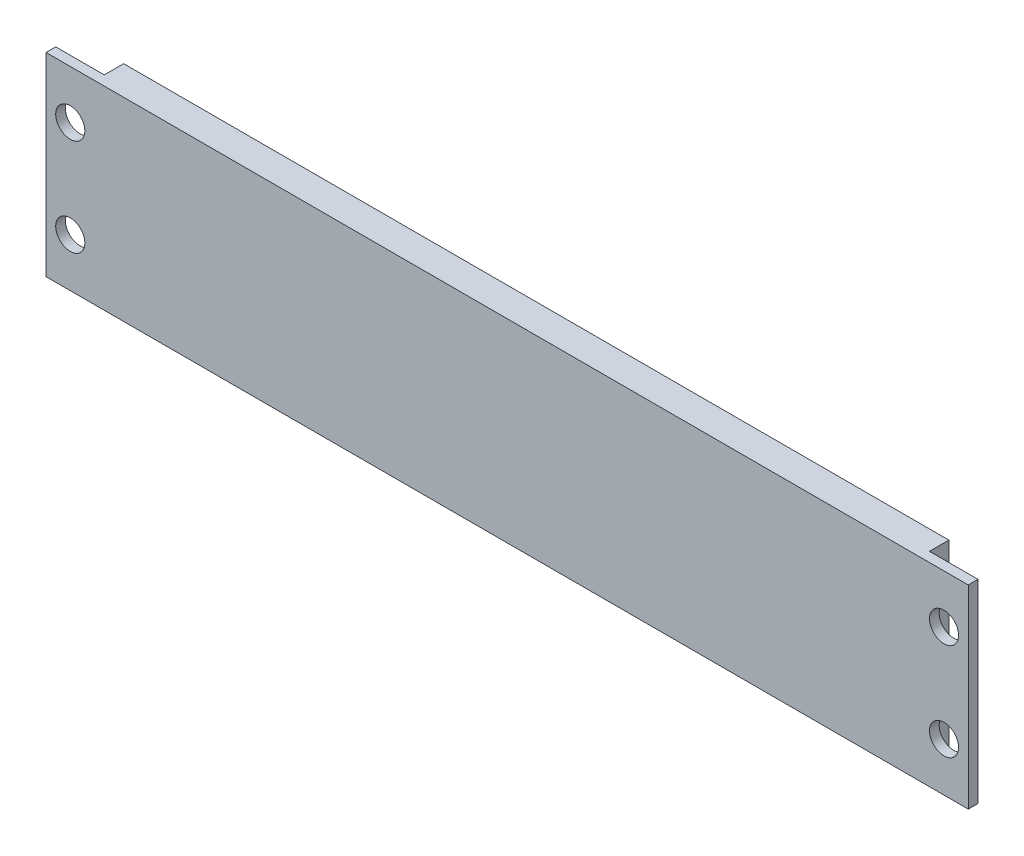
ISO-10303-21;
HEADER;
FILE_DESCRIPTION(('STEP AP214'),'2;1');
FILE_NAME('part.step','',(''),(''),'','','');
FILE_SCHEMA(('AUTOMOTIVE_DESIGN { 1 0 10303 214 1 1 1 1 }'));
ENDSEC;
DATA;
#1=APPLICATION_CONTEXT('core data for automotive mechanical design processes');
#2=APPLICATION_PROTOCOL_DEFINITION('international standard','automotive_design',2000,#1);
#3=PRODUCT_CONTEXT('',#1,'mechanical');
#4=PRODUCT('Part','Part','',(#3));
#5=PRODUCT_RELATED_PRODUCT_CATEGORY('part','',(#4));
#6=PRODUCT_DEFINITION_FORMATION('','',#4);
#7=PRODUCT_DEFINITION_CONTEXT('part definition',#1,'design');
#8=PRODUCT_DEFINITION('design','',#6,#7);
#9=PRODUCT_DEFINITION_SHAPE('','',#8);
#10=(LENGTH_UNIT() NAMED_UNIT(*) SI_UNIT(.MILLI.,.METRE.));
#11=(NAMED_UNIT(*) PLANE_ANGLE_UNIT() SI_UNIT($,.RADIAN.));
#12=(NAMED_UNIT(*) SI_UNIT($,.STERADIAN.) SOLID_ANGLE_UNIT());
#13=UNCERTAINTY_MEASURE_WITH_UNIT(LENGTH_MEASURE(1.E-05),#10,'distance_accuracy_value','');
#14=(GEOMETRIC_REPRESENTATION_CONTEXT(3) GLOBAL_UNCERTAINTY_ASSIGNED_CONTEXT((#13)) GLOBAL_UNIT_ASSIGNED_CONTEXT((#10,
#11,#12)) REPRESENTATION_CONTEXT('',''));
#15=CARTESIAN_POINT('',(0.,0.,0.));
#16=DIRECTION('',(0.,0.,1.));
#17=DIRECTION('',(1.,0.,0.));
#18=AXIS2_PLACEMENT_3D('',#15,#16,#17);
#19=CARTESIAN_POINT('',(0.,20.,3.));
#20=DIRECTION('',(1.,0.,0.));
#21=DIRECTION('',(0.,0.,-1.));
#22=AXIS2_PLACEMENT_3D('',#19,#20,#21);
#23=PLANE('',#22);
#24=DIRECTION('',(0.,-1.,0.));
#25=VECTOR('',#24,1.);
#26=CARTESIAN_POINT('',(0.,0.,2.));
#27=LINE('',#26,#25);
#28=CARTESIAN_POINT('',(0.,20.,2.));
#29=VERTEX_POINT('',#28);
#30=CARTESIAN_POINT('',(0.,0.,2.));
#31=VERTEX_POINT('',#30);
#32=EDGE_CURVE('E54',#29,#31,#27,.T.);
#33=ORIENTED_EDGE('',*,*,#32,.F.);
#34=DIRECTION('',(0.,0.,-1.));
#35=VECTOR('',#34,1.);
#36=CARTESIAN_POINT('',(0.,20.,3.));
#37=LINE('',#36,#35);
#38=CARTESIAN_POINT('',(0.,20.,0.));
#39=VERTEX_POINT('',#38);
#40=EDGE_CURVE('E189',#29,#39,#37,.T.);
#41=ORIENTED_EDGE('',*,*,#40,.T.);
#42=DIRECTION('',(0.,-1.,0.));
#43=VECTOR('',#42,1.);
#44=CARTESIAN_POINT('',(0.,20.,0.));
#45=LINE('',#44,#43);
#46=CARTESIAN_POINT('',(0.,0.,0.));
#47=VERTEX_POINT('',#46);
#48=EDGE_CURVE('E176',#39,#47,#45,.T.);
#49=ORIENTED_EDGE('',*,*,#48,.T.);
#50=DIRECTION('',(0.,0.,-1.));
#51=VECTOR('',#50,1.);
#52=CARTESIAN_POINT('',(0.,0.,3.));
#53=LINE('',#52,#51);
#54=EDGE_CURVE('E178',#31,#47,#53,.T.);
#55=ORIENTED_EDGE('',*,*,#54,.F.);
#56=EDGE_LOOP('',(#33,#41,#49,#55));
#57=FACE_BOUND('',#56,.T.);
#58=ADVANCED_FACE('F39',(#57),#23,.F.);
#59=CARTESIAN_POINT('',(85.,0.,3.));
#60=DIRECTION('',(-1.,0.,0.));
#61=DIRECTION('',(0.,0.,1.));
#62=AXIS2_PLACEMENT_3D('',#59,#60,#61);
#63=PLANE('',#62);
#64=DIRECTION('',(0.,1.,0.));
#65=VECTOR('',#64,1.);
#66=CARTESIAN_POINT('',(85.,0.,2.));
#67=LINE('',#66,#65);
#68=CARTESIAN_POINT('',(85.,0.,2.));
#69=VERTEX_POINT('',#68);
#70=CARTESIAN_POINT('',(85.,20.,2.));
#71=VERTEX_POINT('',#70);
#72=EDGE_CURVE('E61',#69,#71,#67,.T.);
#73=ORIENTED_EDGE('',*,*,#72,.F.);
#74=DIRECTION('',(0.,0.,-1.));
#75=VECTOR('',#74,1.);
#76=CARTESIAN_POINT('',(85.,0.,3.));
#77=LINE('',#76,#75);
#78=CARTESIAN_POINT('',(85.,0.,0.));
#79=VERTEX_POINT('',#78);
#80=EDGE_CURVE('E11',#69,#79,#77,.T.);
#81=ORIENTED_EDGE('',*,*,#80,.T.);
#82=DIRECTION('',(0.,1.,0.));
#83=VECTOR('',#82,1.);
#84=CARTESIAN_POINT('',(85.,0.,0.));
#85=LINE('',#84,#83);
#86=CARTESIAN_POINT('',(85.,20.,0.));
#87=VERTEX_POINT('',#86);
#88=EDGE_CURVE('E180',#79,#87,#85,.T.);
#89=ORIENTED_EDGE('',*,*,#88,.T.);
#90=DIRECTION('',(0.,0.,-1.));
#91=VECTOR('',#90,1.);
#92=CARTESIAN_POINT('',(85.,20.,3.));
#93=LINE('',#92,#91);
#94=EDGE_CURVE('E47',#71,#87,#93,.T.);
#95=ORIENTED_EDGE('',*,*,#94,.F.);
#96=EDGE_LOOP('',(#73,#81,#89,#95));
#97=FACE_BOUND('',#96,.T.);
#98=ADVANCED_FACE('F196',(#97),#63,.F.);
#99=CARTESIAN_POINT('',(0.,0.,3.));
#100=DIRECTION('',(0.,1.,0.));
#101=DIRECTION('',(0.,0.,1.));
#102=AXIS2_PLACEMENT_3D('',#99,#100,#101);
#103=PLANE('',#102);
#104=DIRECTION('',(1.,0.,0.));
#105=VECTOR('',#104,1.);
#106=CARTESIAN_POINT('',(0.,0.,0.));
#107=LINE('',#106,#105);
#108=EDGE_CURVE('E172',#47,#79,#107,.T.);
#109=ORIENTED_EDGE('',*,*,#108,.T.);
#110=ORIENTED_EDGE('',*,*,#80,.F.);
#111=DIRECTION('',(1.,0.,0.));
#112=VECTOR('',#111,1.);
#113=CARTESIAN_POINT('',(0.,0.,2.));
#114=LINE('',#113,#112);
#115=CARTESIAN_POINT('',(90.,0.,2.));
#116=VERTEX_POINT('',#115);
#117=EDGE_CURVE('E152',#69,#116,#114,.T.);
#118=ORIENTED_EDGE('',*,*,#117,.T.);
#119=DIRECTION('',(0.,0.,1.));
#120=VECTOR('',#119,1.);
#121=CARTESIAN_POINT('',(90.,0.,2.));
#122=LINE('',#121,#120);
#123=CARTESIAN_POINT('',(90.,0.,3.));
#124=VERTEX_POINT('',#123);
#125=EDGE_CURVE('E161',#116,#124,#122,.T.);
#126=ORIENTED_EDGE('',*,*,#125,.T.);
#127=DIRECTION('',(1.,0.,0.));
#128=VECTOR('',#127,1.);
#129=CARTESIAN_POINT('',(0.,0.,3.));
#130=LINE('',#129,#128);
#131=CARTESIAN_POINT('',(-5.,0.,3.));
#132=VERTEX_POINT('',#131);
#133=EDGE_CURVE('E108',#132,#124,#130,.T.);
#134=ORIENTED_EDGE('',*,*,#133,.F.);
#135=DIRECTION('',(0.,0.,1.));
#136=VECTOR('',#135,1.);
#137=CARTESIAN_POINT('',(-5.,0.,2.));
#138=LINE('',#137,#136);
#139=CARTESIAN_POINT('',(-5.,0.,2.));
#140=VERTEX_POINT('',#139);
#141=EDGE_CURVE('E103',#140,#132,#138,.T.);
#142=ORIENTED_EDGE('',*,*,#141,.F.);
#143=DIRECTION('',(1.,0.,0.));
#144=VECTOR('',#143,1.);
#145=CARTESIAN_POINT('',(0.,0.,2.));
#146=LINE('',#145,#144);
#147=EDGE_CURVE('E106',#140,#31,#146,.T.);
#148=ORIENTED_EDGE('',*,*,#147,.T.);
#149=ORIENTED_EDGE('',*,*,#54,.T.);
#150=EDGE_LOOP('',(#109,#110,#118,#126,#134,#142,#148,#149));
#151=FACE_BOUND('',#150,.T.);
#152=ADVANCED_FACE('F41',(#151),#103,.F.);
#153=CARTESIAN_POINT('',(85.,20.,3.));
#154=DIRECTION('',(0.,-1.,0.));
#155=DIRECTION('',(0.,0.,-1.));
#156=AXIS2_PLACEMENT_3D('',#153,#154,#155);
#157=PLANE('',#156);
#158=DIRECTION('',(-1.,0.,0.));
#159=VECTOR('',#158,1.);
#160=CARTESIAN_POINT('',(85.,20.,0.));
#161=LINE('',#160,#159);
#162=EDGE_CURVE('E183',#87,#39,#161,.T.);
#163=ORIENTED_EDGE('',*,*,#162,.T.);
#164=ORIENTED_EDGE('',*,*,#40,.F.);
#165=DIRECTION('',(-1.,0.,0.));
#166=VECTOR('',#165,1.);
#167=CARTESIAN_POINT('',(0.,20.,2.));
#168=LINE('',#167,#166);
#169=CARTESIAN_POINT('',(-5.,20.,2.));
#170=VERTEX_POINT('',#169);
#171=EDGE_CURVE('E114',#29,#170,#168,.T.);
#172=ORIENTED_EDGE('',*,*,#171,.T.);
#173=DIRECTION('',(0.,0.,1.));
#174=VECTOR('',#173,1.);
#175=CARTESIAN_POINT('',(-5.,20.,2.));
#176=LINE('',#175,#174);
#177=CARTESIAN_POINT('',(-5.,20.,3.));
#178=VERTEX_POINT('',#177);
#179=EDGE_CURVE('E113',#170,#178,#176,.T.);
#180=ORIENTED_EDGE('',*,*,#179,.T.);
#181=DIRECTION('',(-1.,0.,0.));
#182=VECTOR('',#181,1.);
#183=CARTESIAN_POINT('',(85.,20.,3.));
#184=LINE('',#183,#182);
#185=CARTESIAN_POINT('',(90.,20.,3.));
#186=VERTEX_POINT('',#185);
#187=EDGE_CURVE('E175',#186,#178,#184,.T.);
#188=ORIENTED_EDGE('',*,*,#187,.F.);
#189=DIRECTION('',(0.,0.,1.));
#190=VECTOR('',#189,1.);
#191=CARTESIAN_POINT('',(90.,20.,2.));
#192=LINE('',#191,#190);
#193=CARTESIAN_POINT('',(90.,20.,2.));
#194=VERTEX_POINT('',#193);
#195=EDGE_CURVE('E169',#194,#186,#192,.T.);
#196=ORIENTED_EDGE('',*,*,#195,.F.);
#197=DIRECTION('',(-1.,0.,0.));
#198=VECTOR('',#197,1.);
#199=CARTESIAN_POINT('',(0.,20.,2.));
#200=LINE('',#199,#198);
#201=EDGE_CURVE('E158',#194,#71,#200,.T.);
#202=ORIENTED_EDGE('',*,*,#201,.T.);
#203=ORIENTED_EDGE('',*,*,#94,.T.);
#204=EDGE_LOOP('',(#163,#164,#172,#180,#188,#196,#202,#203));
#205=FACE_BOUND('',#204,.T.);
#206=ADVANCED_FACE('F191',(#205),#157,.F.);
#207=CARTESIAN_POINT('',(0.,0.,3.));
#208=DIRECTION('',(0.,0.,1.));
#209=DIRECTION('',(1.,0.,0.));
#210=AXIS2_PLACEMENT_3D('',#207,#208,#209);
#211=PLANE('',#210);
#212=ORIENTED_EDGE('',*,*,#133,.T.);
#213=DIRECTION('',(0.,1.,0.));
#214=VECTOR('',#213,1.);
#215=CARTESIAN_POINT('',(90.,0.,3.));
#216=LINE('',#215,#214);
#217=EDGE_CURVE('E148',#124,#186,#216,.T.);
#218=ORIENTED_EDGE('',*,*,#217,.T.);
#219=ORIENTED_EDGE('',*,*,#187,.T.);
#220=DIRECTION('',(0.,-1.,0.));
#221=VECTOR('',#220,1.);
#222=CARTESIAN_POINT('',(-5.,0.,3.));
#223=LINE('',#222,#221);
#224=EDGE_CURVE('E140',#178,#132,#223,.T.);
#225=ORIENTED_EDGE('',*,*,#224,.T.);
#226=EDGE_LOOP('',(#212,#218,#219,#225));
#227=FACE_BOUND('',#226,.T.);
#228=CARTESIAN_POINT('',(87.5,15.,3.));
#229=DIRECTION('',(0.,0.,1.));
#230=DIRECTION('',(1.,0.,0.));
#231=AXIS2_PLACEMENT_3D('',#228,#229,#230);
#232=CIRCLE('',#231,1.5);
#233=CARTESIAN_POINT('',(89.,15.,3.));
#234=VERTEX_POINT('',#233);
#235=EDGE_CURVE('E142',#234,#234,#232,.T.);
#236=ORIENTED_EDGE('',*,*,#235,.F.);
#237=EDGE_LOOP('',(#236));
#238=FACE_BOUND('',#237,.T.);
#239=CARTESIAN_POINT('',(87.5,5.,3.));
#240=DIRECTION('',(0.,0.,1.));
#241=DIRECTION('',(1.,0.,0.));
#242=AXIS2_PLACEMENT_3D('',#239,#240,#241);
#243=CIRCLE('',#242,1.5);
#244=CARTESIAN_POINT('',(89.,5.,3.));
#245=VERTEX_POINT('',#244);
#246=EDGE_CURVE('E164',#245,#245,#243,.T.);
#247=ORIENTED_EDGE('',*,*,#246,.F.);
#248=EDGE_LOOP('',(#247));
#249=FACE_BOUND('',#248,.T.);
#250=CARTESIAN_POINT('',(-2.5,15.,3.));
#251=DIRECTION('',(0.,0.,1.));
#252=DIRECTION('',(1.,0.,0.));
#253=AXIS2_PLACEMENT_3D('',#250,#251,#252);
#254=CIRCLE('',#253,1.5);
#255=CARTESIAN_POINT('',(-1.,15.,3.));
#256=VERTEX_POINT('',#255);
#257=EDGE_CURVE('E134',#256,#256,#254,.T.);
#258=ORIENTED_EDGE('',*,*,#257,.F.);
#259=EDGE_LOOP('',(#258));
#260=FACE_BOUND('',#259,.T.);
#261=CARTESIAN_POINT('',(-2.5,5.,3.));
#262=DIRECTION('',(0.,0.,1.));
#263=DIRECTION('',(1.,0.,0.));
#264=AXIS2_PLACEMENT_3D('',#261,#262,#263);
#265=CIRCLE('',#264,1.5);
#266=CARTESIAN_POINT('',(-1.,5.,3.));
#267=VERTEX_POINT('',#266);
#268=EDGE_CURVE('E137',#267,#267,#265,.T.);
#269=ORIENTED_EDGE('',*,*,#268,.F.);
#270=EDGE_LOOP('',(#269));
#271=FACE_BOUND('',#270,.T.);
#272=ADVANCED_FACE('F201',(#227,#238,#249,#260,#271),#211,.T.);
#273=CARTESIAN_POINT('',(0.,0.,0.));
#274=DIRECTION('',(0.,0.,1.));
#275=DIRECTION('',(1.,0.,0.));
#276=AXIS2_PLACEMENT_3D('',#273,#274,#275);
#277=PLANE('',#276);
#278=ORIENTED_EDGE('',*,*,#108,.F.);
#279=ORIENTED_EDGE('',*,*,#48,.F.);
#280=ORIENTED_EDGE('',*,*,#162,.F.);
#281=ORIENTED_EDGE('',*,*,#88,.F.);
#282=EDGE_LOOP('',(#278,#279,#280,#281));
#283=FACE_BOUND('',#282,.T.);
#284=ADVANCED_FACE('F199',(#283),#277,.F.);
#285=CARTESIAN_POINT('',(90.,0.,2.));
#286=DIRECTION('',(1.,0.,0.));
#287=DIRECTION('',(0.,0.,-1.));
#288=AXIS2_PLACEMENT_3D('',#285,#286,#287);
#289=PLANE('',#288);
#290=ORIENTED_EDGE('',*,*,#217,.F.);
#291=ORIENTED_EDGE('',*,*,#125,.F.);
#292=DIRECTION('',(0.,1.,0.));
#293=VECTOR('',#292,1.);
#294=CARTESIAN_POINT('',(90.,0.,2.));
#295=LINE('',#294,#293);
#296=EDGE_CURVE('E155',#116,#194,#295,.T.);
#297=ORIENTED_EDGE('',*,*,#296,.T.);
#298=ORIENTED_EDGE('',*,*,#195,.T.);
#299=EDGE_LOOP('',(#290,#291,#297,#298));
#300=FACE_BOUND('',#299,.T.);
#301=ADVANCED_FACE('F205',(#300),#289,.T.);
#302=CARTESIAN_POINT('',(87.5,5.,2.));
#303=DIRECTION('',(0.,0.,1.));
#304=DIRECTION('',(1.,0.,0.));
#305=AXIS2_PLACEMENT_3D('',#302,#303,#304);
#306=CYLINDRICAL_SURFACE('',#305,1.5);
#307=CARTESIAN_POINT('',(87.5,5.,2.));
#308=DIRECTION('',(0.,0.,1.));
#309=DIRECTION('',(1.,0.,0.));
#310=AXIS2_PLACEMENT_3D('',#307,#308,#309);
#311=CIRCLE('',#310,1.5);
#312=CARTESIAN_POINT('',(89.,5.,2.));
#313=VERTEX_POINT('',#312);
#314=EDGE_CURVE('E147',#313,#313,#311,.T.);
#315=ORIENTED_EDGE('',*,*,#314,.F.);
#316=EDGE_LOOP('',(#315));
#317=FACE_BOUND('',#316,.T.);
#318=ORIENTED_EDGE('',*,*,#246,.T.);
#319=EDGE_LOOP('',(#318));
#320=FACE_BOUND('',#319,.T.);
#321=ADVANCED_FACE('F220',(#317,#320),#306,.F.);
#322=CARTESIAN_POINT('',(87.5,15.,2.));
#323=DIRECTION('',(0.,0.,1.));
#324=DIRECTION('',(1.,0.,0.));
#325=AXIS2_PLACEMENT_3D('',#322,#323,#324);
#326=CYLINDRICAL_SURFACE('',#325,1.5);
#327=CARTESIAN_POINT('',(87.5,15.,2.));
#328=DIRECTION('',(0.,0.,1.));
#329=DIRECTION('',(1.,0.,0.));
#330=AXIS2_PLACEMENT_3D('',#327,#328,#329);
#331=CIRCLE('',#330,1.5);
#332=CARTESIAN_POINT('',(89.,15.,2.));
#333=VERTEX_POINT('',#332);
#334=EDGE_CURVE('E144',#333,#333,#331,.T.);
#335=ORIENTED_EDGE('',*,*,#334,.F.);
#336=EDGE_LOOP('',(#335));
#337=FACE_BOUND('',#336,.T.);
#338=ORIENTED_EDGE('',*,*,#235,.T.);
#339=EDGE_LOOP('',(#338));
#340=FACE_BOUND('',#339,.T.);
#341=ADVANCED_FACE('F211',(#337,#340),#326,.F.);
#342=CARTESIAN_POINT('',(0.,0.,2.));
#343=DIRECTION('',(0.,0.,1.));
#344=DIRECTION('',(1.,0.,0.));
#345=AXIS2_PLACEMENT_3D('',#342,#343,#344);
#346=PLANE('',#345);
#347=ORIENTED_EDGE('',*,*,#334,.T.);
#348=EDGE_LOOP('',(#347));
#349=FACE_BOUND('',#348,.T.);
#350=ORIENTED_EDGE('',*,*,#314,.T.);
#351=EDGE_LOOP('',(#350));
#352=FACE_BOUND('',#351,.T.);
#353=ORIENTED_EDGE('',*,*,#72,.T.);
#354=ORIENTED_EDGE('',*,*,#201,.F.);
#355=ORIENTED_EDGE('',*,*,#296,.F.);
#356=ORIENTED_EDGE('',*,*,#117,.F.);
#357=EDGE_LOOP('',(#353,#354,#355,#356));
#358=FACE_BOUND('',#357,.T.);
#359=ADVANCED_FACE('F209',(#349,#352,#358),#346,.F.);
#360=CARTESIAN_POINT('',(-5.,0.,2.));
#361=DIRECTION('',(-1.,0.,0.));
#362=DIRECTION('',(0.,0.,1.));
#363=AXIS2_PLACEMENT_3D('',#360,#361,#362);
#364=PLANE('',#363);
#365=ORIENTED_EDGE('',*,*,#224,.F.);
#366=ORIENTED_EDGE('',*,*,#179,.F.);
#367=DIRECTION('',(0.,-1.,0.));
#368=VECTOR('',#367,1.);
#369=CARTESIAN_POINT('',(-5.,0.,2.));
#370=LINE('',#369,#368);
#371=EDGE_CURVE('E120',#170,#140,#370,.T.);
#372=ORIENTED_EDGE('',*,*,#371,.T.);
#373=ORIENTED_EDGE('',*,*,#141,.T.);
#374=EDGE_LOOP('',(#365,#366,#372,#373));
#375=FACE_BOUND('',#374,.T.);
#376=ADVANCED_FACE('F123',(#375),#364,.T.);
#377=CARTESIAN_POINT('',(-2.5,5.,2.));
#378=DIRECTION('',(0.,0.,1.));
#379=DIRECTION('',(1.,0.,0.));
#380=AXIS2_PLACEMENT_3D('',#377,#378,#379);
#381=CYLINDRICAL_SURFACE('',#380,1.5);
#382=CARTESIAN_POINT('',(-2.5,5.,2.));
#383=DIRECTION('',(0.,0.,1.));
#384=DIRECTION('',(1.,0.,0.));
#385=AXIS2_PLACEMENT_3D('',#382,#383,#384);
#386=CIRCLE('',#385,1.5);
#387=CARTESIAN_POINT('',(-1.,5.,2.));
#388=VERTEX_POINT('',#387);
#389=EDGE_CURVE('E125',#388,#388,#386,.T.);
#390=ORIENTED_EDGE('',*,*,#389,.F.);
#391=EDGE_LOOP('',(#390));
#392=FACE_BOUND('',#391,.T.);
#393=ORIENTED_EDGE('',*,*,#268,.T.);
#394=EDGE_LOOP('',(#393));
#395=FACE_BOUND('',#394,.T.);
#396=ADVANCED_FACE('F218',(#392,#395),#381,.F.);
#397=CARTESIAN_POINT('',(-2.5,15.,2.));
#398=DIRECTION('',(0.,0.,1.));
#399=DIRECTION('',(1.,0.,0.));
#400=AXIS2_PLACEMENT_3D('',#397,#398,#399);
#401=CYLINDRICAL_SURFACE('',#400,1.5);
#402=CARTESIAN_POINT('',(-2.5,15.,2.));
#403=DIRECTION('',(0.,0.,1.));
#404=DIRECTION('',(1.,0.,0.));
#405=AXIS2_PLACEMENT_3D('',#402,#403,#404);
#406=CIRCLE('',#405,1.5);
#407=CARTESIAN_POINT('',(-1.,15.,2.));
#408=VERTEX_POINT('',#407);
#409=EDGE_CURVE('E128',#408,#408,#406,.T.);
#410=ORIENTED_EDGE('',*,*,#409,.F.);
#411=EDGE_LOOP('',(#410));
#412=FACE_BOUND('',#411,.T.);
#413=ORIENTED_EDGE('',*,*,#257,.T.);
#414=EDGE_LOOP('',(#413));
#415=FACE_BOUND('',#414,.T.);
#416=ADVANCED_FACE('F297',(#412,#415),#401,.F.);
#417=CARTESIAN_POINT('',(0.,0.,2.));
#418=DIRECTION('',(0.,0.,1.));
#419=DIRECTION('',(1.,0.,0.));
#420=AXIS2_PLACEMENT_3D('',#417,#418,#419);
#421=PLANE('',#420);
#422=ORIENTED_EDGE('',*,*,#409,.T.);
#423=EDGE_LOOP('',(#422));
#424=FACE_BOUND('',#423,.T.);
#425=ORIENTED_EDGE('',*,*,#389,.T.);
#426=EDGE_LOOP('',(#425));
#427=FACE_BOUND('',#426,.T.);
#428=ORIENTED_EDGE('',*,*,#371,.F.);
#429=ORIENTED_EDGE('',*,*,#171,.F.);
#430=ORIENTED_EDGE('',*,*,#32,.T.);
#431=ORIENTED_EDGE('',*,*,#147,.F.);
#432=EDGE_LOOP('',(#428,#429,#430,#431));
#433=FACE_BOUND('',#432,.T.);
#434=ADVANCED_FACE('F118',(#424,#427,#433),#421,.F.);
#435=CLOSED_SHELL('',(#58,#98,#152,#206,#272,#284,#301,#321,#341,#359,#376,#396,#416,#434));
#436=MANIFOLD_SOLID_BREP('B2',#435);
#437=ADVANCED_BREP_SHAPE_REPRESENTATION('',(#18,#436),#14);
#438=SHAPE_DEFINITION_REPRESENTATION(#9,#437);
ENDSEC;
END-ISO-10303-21;
